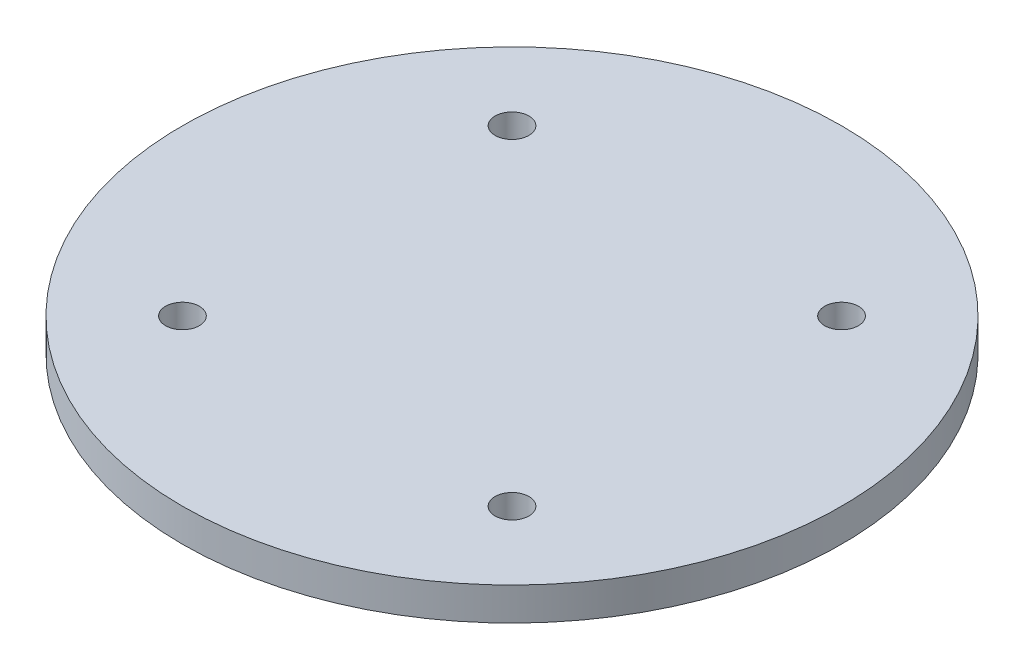
ISO-10303-21;
HEADER;
FILE_DESCRIPTION(('STEP AP214'),'2;1');
FILE_NAME('part.step','',(''),(''),'','','');
FILE_SCHEMA(('AUTOMOTIVE_DESIGN { 1 0 10303 214 1 1 1 1 }'));
ENDSEC;
DATA;
#1=APPLICATION_CONTEXT('core data for automotive mechanical design processes');
#2=APPLICATION_PROTOCOL_DEFINITION('international standard','automotive_design',2000,#1);
#3=PRODUCT_CONTEXT('',#1,'mechanical');
#4=PRODUCT('Part','Part','',(#3));
#5=PRODUCT_RELATED_PRODUCT_CATEGORY('part','',(#4));
#6=PRODUCT_DEFINITION_FORMATION('','',#4);
#7=PRODUCT_DEFINITION_CONTEXT('part definition',#1,'design');
#8=PRODUCT_DEFINITION('design','',#6,#7);
#9=PRODUCT_DEFINITION_SHAPE('','',#8);
#10=(LENGTH_UNIT() NAMED_UNIT(*) SI_UNIT(.MILLI.,.METRE.));
#11=(NAMED_UNIT(*) PLANE_ANGLE_UNIT() SI_UNIT($,.RADIAN.));
#12=(NAMED_UNIT(*) SI_UNIT($,.STERADIAN.) SOLID_ANGLE_UNIT());
#13=UNCERTAINTY_MEASURE_WITH_UNIT(LENGTH_MEASURE(1.E-05),#10,'distance_accuracy_value','');
#14=(GEOMETRIC_REPRESENTATION_CONTEXT(3) GLOBAL_UNCERTAINTY_ASSIGNED_CONTEXT((#13)) GLOBAL_UNIT_ASSIGNED_CONTEXT((#10,
#11,#12)) REPRESENTATION_CONTEXT('',''));
#15=CARTESIAN_POINT('',(0.,0.,0.));
#16=DIRECTION('',(0.,0.,1.));
#17=DIRECTION('',(1.,0.,0.));
#18=AXIS2_PLACEMENT_3D('',#15,#16,#17);
#19=CARTESIAN_POINT('',(0.,2.,0.));
#20=DIRECTION('',(0.,-1.,0.));
#21=DIRECTION('',(0.,0.,-1.));
#22=AXIS2_PLACEMENT_3D('',#19,#20,#21);
#23=CYLINDRICAL_SURFACE('',#22,20.);
#24=CARTESIAN_POINT('',(0.,2.,0.));
#25=DIRECTION('',(0.,1.,0.));
#26=DIRECTION('',(0.,0.,1.));
#27=AXIS2_PLACEMENT_3D('',#24,#25,#26);
#28=CIRCLE('',#27,20.);
#29=CARTESIAN_POINT('',(0.,2.,20.));
#30=VERTEX_POINT('',#29);
#31=EDGE_CURVE('E10',#30,#30,#28,.T.);
#32=ORIENTED_EDGE('',*,*,#31,.F.);
#33=EDGE_LOOP('',(#32));
#34=FACE_BOUND('',#33,.T.);
#35=CARTESIAN_POINT('',(0.,0.,0.));
#36=DIRECTION('',(0.,1.,0.));
#37=DIRECTION('',(0.,0.,1.));
#38=AXIS2_PLACEMENT_3D('',#35,#36,#37);
#39=CIRCLE('',#38,20.);
#40=CARTESIAN_POINT('',(0.,0.,20.));
#41=VERTEX_POINT('',#40);
#42=EDGE_CURVE('E42',#41,#41,#39,.T.);
#43=ORIENTED_EDGE('',*,*,#42,.T.);
#44=EDGE_LOOP('',(#43));
#45=FACE_BOUND('',#44,.T.);
#46=ADVANCED_FACE('F39',(#34,#45),#23,.T.);
#47=CARTESIAN_POINT('',(0.,2.,0.));
#48=DIRECTION('',(0.,1.,0.));
#49=DIRECTION('',(0.,0.,1.));
#50=AXIS2_PLACEMENT_3D('',#47,#48,#49);
#51=PLANE('',#50);
#52=CARTESIAN_POINT('',(-9.99999999999999,2.,-10.));
#53=DIRECTION('',(0.,1.,0.));
#54=DIRECTION('',(0.,0.,1.));
#55=AXIS2_PLACEMENT_3D('',#52,#53,#54);
#56=CIRCLE('',#55,1.02499999999999);
#57=CARTESIAN_POINT('',(-9.99999999999999,2.,-8.97500000000001));
#58=VERTEX_POINT('',#57);
#59=EDGE_CURVE('E80',#58,#58,#56,.T.);
#60=ORIENTED_EDGE('',*,*,#59,.F.);
#61=EDGE_LOOP('',(#60));
#62=FACE_BOUND('',#61,.T.);
#63=CARTESIAN_POINT('',(10.,2.,-10.));
#64=DIRECTION('',(0.,1.,0.));
#65=DIRECTION('',(0.,0.,1.));
#66=AXIS2_PLACEMENT_3D('',#63,#64,#65);
#67=CIRCLE('',#66,1.02499999999999);
#68=CARTESIAN_POINT('',(10.,2.,-8.97500000000001));
#69=VERTEX_POINT('',#68);
#70=EDGE_CURVE('E72',#69,#69,#67,.T.);
#71=ORIENTED_EDGE('',*,*,#70,.F.);
#72=EDGE_LOOP('',(#71));
#73=FACE_BOUND('',#72,.T.);
#74=CARTESIAN_POINT('',(-9.99999999999999,2.,10.));
#75=DIRECTION('',(0.,1.,0.));
#76=DIRECTION('',(0.,0.,1.));
#77=AXIS2_PLACEMENT_3D('',#74,#75,#76);
#78=CIRCLE('',#77,1.02499999999999);
#79=CARTESIAN_POINT('',(-9.99999999999999,2.,11.025));
#80=VERTEX_POINT('',#79);
#81=EDGE_CURVE('E64',#80,#80,#78,.T.);
#82=ORIENTED_EDGE('',*,*,#81,.F.);
#83=EDGE_LOOP('',(#82));
#84=FACE_BOUND('',#83,.T.);
#85=CARTESIAN_POINT('',(10.,2.,10.));
#86=DIRECTION('',(0.,1.,0.));
#87=DIRECTION('',(0.,0.,1.));
#88=AXIS2_PLACEMENT_3D('',#85,#86,#87);
#89=CIRCLE('',#88,1.02499999999999);
#90=CARTESIAN_POINT('',(10.,2.,11.025));
#91=VERTEX_POINT('',#90);
#92=EDGE_CURVE('E56',#91,#91,#89,.T.);
#93=ORIENTED_EDGE('',*,*,#92,.F.);
#94=EDGE_LOOP('',(#93));
#95=FACE_BOUND('',#94,.T.);
#96=ORIENTED_EDGE('',*,*,#31,.T.);
#97=EDGE_LOOP('',(#96));
#98=FACE_BOUND('',#97,.T.);
#99=ADVANCED_FACE('F87',(#62,#73,#84,#95,#98),#51,.T.);
#100=CARTESIAN_POINT('',(0.,0.,0.));
#101=DIRECTION('',(0.,1.,0.));
#102=DIRECTION('',(0.,0.,1.));
#103=AXIS2_PLACEMENT_3D('',#100,#101,#102);
#104=PLANE('',#103);
#105=CARTESIAN_POINT('',(-9.99999999999999,0.,-10.));
#106=DIRECTION('',(0.,1.,0.));
#107=DIRECTION('',(0.,0.,1.));
#108=AXIS2_PLACEMENT_3D('',#105,#106,#107);
#109=CIRCLE('',#108,1.025);
#110=CARTESIAN_POINT('',(-9.99999999999999,0.,-8.975));
#111=VERTEX_POINT('',#110);
#112=EDGE_CURVE('E76',#111,#111,#109,.T.);
#113=ORIENTED_EDGE('',*,*,#112,.T.);
#114=EDGE_LOOP('',(#113));
#115=FACE_BOUND('',#114,.T.);
#116=CARTESIAN_POINT('',(10.,0.,-10.));
#117=DIRECTION('',(0.,1.,0.));
#118=DIRECTION('',(0.,0.,1.));
#119=AXIS2_PLACEMENT_3D('',#116,#117,#118);
#120=CIRCLE('',#119,1.025);
#121=CARTESIAN_POINT('',(10.,0.,-8.975));
#122=VERTEX_POINT('',#121);
#123=EDGE_CURVE('E68',#122,#122,#120,.T.);
#124=ORIENTED_EDGE('',*,*,#123,.T.);
#125=EDGE_LOOP('',(#124));
#126=FACE_BOUND('',#125,.T.);
#127=CARTESIAN_POINT('',(-9.99999999999999,0.,10.));
#128=DIRECTION('',(0.,1.,0.));
#129=DIRECTION('',(0.,0.,1.));
#130=AXIS2_PLACEMENT_3D('',#127,#128,#129);
#131=CIRCLE('',#130,1.025);
#132=CARTESIAN_POINT('',(-9.99999999999999,0.,11.025));
#133=VERTEX_POINT('',#132);
#134=EDGE_CURVE('E60',#133,#133,#131,.T.);
#135=ORIENTED_EDGE('',*,*,#134,.T.);
#136=EDGE_LOOP('',(#135));
#137=FACE_BOUND('',#136,.T.);
#138=CARTESIAN_POINT('',(10.,0.,10.));
#139=DIRECTION('',(0.,1.,0.));
#140=DIRECTION('',(0.,0.,1.));
#141=AXIS2_PLACEMENT_3D('',#138,#139,#140);
#142=CIRCLE('',#141,1.025);
#143=CARTESIAN_POINT('',(10.,0.,11.025));
#144=VERTEX_POINT('',#143);
#145=EDGE_CURVE('E51',#144,#144,#142,.T.);
#146=ORIENTED_EDGE('',*,*,#145,.T.);
#147=EDGE_LOOP('',(#146));
#148=FACE_BOUND('',#147,.T.);
#149=ORIENTED_EDGE('',*,*,#42,.F.);
#150=EDGE_LOOP('',(#149));
#151=FACE_BOUND('',#150,.T.);
#152=ADVANCED_FACE('F90',(#115,#126,#137,#148,#151),#104,.F.);
#153=CARTESIAN_POINT('',(10.,2.,10.));
#154=DIRECTION('',(0.,1.,0.));
#155=DIRECTION('',(0.,0.,1.));
#156=AXIS2_PLACEMENT_3D('',#153,#154,#155);
#157=CYLINDRICAL_SURFACE('',#156,1.02499999999999);
#158=ORIENTED_EDGE('',*,*,#145,.F.);
#159=EDGE_LOOP('',(#158));
#160=FACE_BOUND('',#159,.T.);
#161=ORIENTED_EDGE('',*,*,#92,.T.);
#162=EDGE_LOOP('',(#161));
#163=FACE_BOUND('',#162,.T.);
#164=ADVANCED_FACE('F98',(#160,#163),#157,.F.);
#165=CARTESIAN_POINT('',(-9.99999999999999,2.,10.));
#166=DIRECTION('',(0.,1.,0.));
#167=DIRECTION('',(0.,0.,1.));
#168=AXIS2_PLACEMENT_3D('',#165,#166,#167);
#169=CYLINDRICAL_SURFACE('',#168,1.02499999999999);
#170=ORIENTED_EDGE('',*,*,#134,.F.);
#171=EDGE_LOOP('',(#170));
#172=FACE_BOUND('',#171,.T.);
#173=ORIENTED_EDGE('',*,*,#81,.T.);
#174=EDGE_LOOP('',(#173));
#175=FACE_BOUND('',#174,.T.);
#176=ADVANCED_FACE('F100',(#172,#175),#169,.F.);
#177=CARTESIAN_POINT('',(10.,2.,-10.));
#178=DIRECTION('',(0.,1.,0.));
#179=DIRECTION('',(0.,0.,1.));
#180=AXIS2_PLACEMENT_3D('',#177,#178,#179);
#181=CYLINDRICAL_SURFACE('',#180,1.02499999999999);
#182=ORIENTED_EDGE('',*,*,#123,.F.);
#183=EDGE_LOOP('',(#182));
#184=FACE_BOUND('',#183,.T.);
#185=ORIENTED_EDGE('',*,*,#70,.T.);
#186=EDGE_LOOP('',(#185));
#187=FACE_BOUND('',#186,.T.);
#188=ADVANCED_FACE('F107',(#184,#187),#181,.F.);
#189=CARTESIAN_POINT('',(-9.99999999999999,2.,-10.));
#190=DIRECTION('',(0.,1.,0.));
#191=DIRECTION('',(0.,0.,1.));
#192=AXIS2_PLACEMENT_3D('',#189,#190,#191);
#193=CYLINDRICAL_SURFACE('',#192,1.02499999999999);
#194=ORIENTED_EDGE('',*,*,#112,.F.);
#195=EDGE_LOOP('',(#194));
#196=FACE_BOUND('',#195,.T.);
#197=ORIENTED_EDGE('',*,*,#59,.T.);
#198=EDGE_LOOP('',(#197));
#199=FACE_BOUND('',#198,.T.);
#200=ADVANCED_FACE('F85',(#196,#199),#193,.F.);
#201=CLOSED_SHELL('',(#46,#99,#152,#164,#176,#188,#200));
#202=MANIFOLD_SOLID_BREP('B2',#201);
#203=ADVANCED_BREP_SHAPE_REPRESENTATION('',(#18,#202),#14);
#204=SHAPE_DEFINITION_REPRESENTATION(#9,#203);
ENDSEC;
END-ISO-10303-21;
